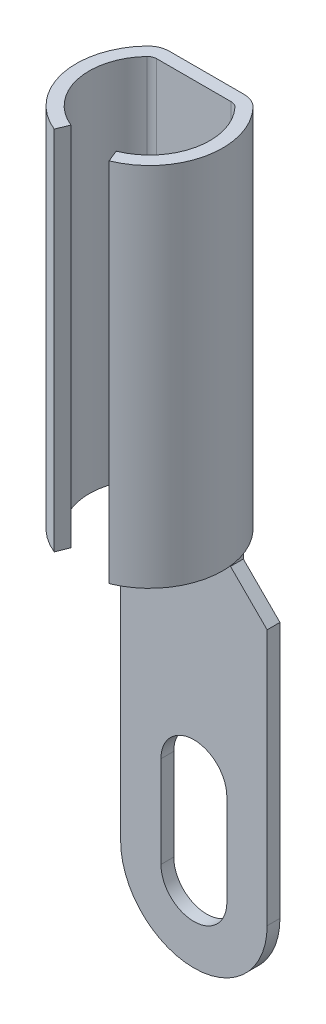
ISO-10303-21;
HEADER;
FILE_DESCRIPTION(('STEP AP214'),'2;1');
FILE_NAME('part.step','',(''),(''),'','','');
FILE_SCHEMA(('AUTOMOTIVE_DESIGN { 1 0 10303 214 1 1 1 1 }'));
ENDSEC;
DATA;
#1=APPLICATION_CONTEXT('core data for automotive mechanical design processes');
#2=APPLICATION_PROTOCOL_DEFINITION('international standard','automotive_design',2000,#1);
#3=PRODUCT_CONTEXT('',#1,'mechanical');
#4=PRODUCT('Part','Part','',(#3));
#5=PRODUCT_RELATED_PRODUCT_CATEGORY('part','',(#4));
#6=PRODUCT_DEFINITION_FORMATION('','',#4);
#7=PRODUCT_DEFINITION_CONTEXT('part definition',#1,'design');
#8=PRODUCT_DEFINITION('design','',#6,#7);
#9=PRODUCT_DEFINITION_SHAPE('','',#8);
#10=(LENGTH_UNIT() NAMED_UNIT(*) SI_UNIT(.MILLI.,.METRE.));
#11=(NAMED_UNIT(*) PLANE_ANGLE_UNIT() SI_UNIT($,.RADIAN.));
#12=(NAMED_UNIT(*) SI_UNIT($,.STERADIAN.) SOLID_ANGLE_UNIT());
#13=UNCERTAINTY_MEASURE_WITH_UNIT(LENGTH_MEASURE(1.E-05),#10,'distance_accuracy_value','');
#14=(GEOMETRIC_REPRESENTATION_CONTEXT(3) GLOBAL_UNCERTAINTY_ASSIGNED_CONTEXT((#13)) GLOBAL_UNIT_ASSIGNED_CONTEXT((#10,
#11,#12)) REPRESENTATION_CONTEXT('',''));
#15=CARTESIAN_POINT('',(0.,0.,0.));
#16=DIRECTION('',(0.,0.,1.));
#17=DIRECTION('',(1.,0.,0.));
#18=AXIS2_PLACEMENT_3D('',#15,#16,#17);
#19=CARTESIAN_POINT('',(0.,0.,0.));
#20=DIRECTION('',(0.,1.,0.));
#21=DIRECTION('',(0.,0.,1.));
#22=AXIS2_PLACEMENT_3D('',#19,#20,#21);
#23=PLANE('',#22);
#24=DIRECTION('',(0.,0.,1.));
#25=VECTOR('',#24,1.);
#26=CARTESIAN_POINT('',(1.,0.,-1.5612494995996));
#27=LINE('',#26,#25);
#28=CARTESIAN_POINT('',(1.,0.,-1.5612494995996));
#29=VERTEX_POINT('',#28);
#30=CARTESIAN_POINT('',(1.,0.,-1.2112494995996));
#31=VERTEX_POINT('',#30);
#32=EDGE_CURVE('E171',#29,#31,#27,.T.);
#33=ORIENTED_EDGE('',*,*,#32,.F.);
#34=DIRECTION('',(-1.,0.,0.));
#35=VECTOR('',#34,1.);
#36=CARTESIAN_POINT('',(-1.01784055702233,0.,-1.5612494995996));
#37=LINE('',#36,#35);
#38=CARTESIAN_POINT('',(1.01784055702233,0.,-1.5612494995996));
#39=VERTEX_POINT('',#38);
#40=EDGE_CURVE('E195',#39,#29,#37,.T.);
#41=ORIENTED_EDGE('',*,*,#40,.F.);
#42=CARTESIAN_POINT('',(1.01784055702233,0.,-0.9612494995996));
#43=DIRECTION('',(0.,1.,0.));
#44=DIRECTION('',(0.,0.,1.));
#45=AXIS2_PLACEMENT_3D('',#42,#43,#44);
#46=CIRCLE('',#45,0.6);
#47=CARTESIAN_POINT('',(1.45405793860332,0.,-1.37321357085657));
#48=VERTEX_POINT('',#47);
#49=EDGE_CURVE('E153',#48,#39,#46,.T.);
#50=ORIENTED_EDGE('',*,*,#49,.F.);
#51=CARTESIAN_POINT('',(0.,0.,0.));
#52=DIRECTION('',(0.,1.,0.));
#53=DIRECTION('',(0.,0.,1.));
#54=AXIS2_PLACEMENT_3D('',#51,#52,#53);
#55=CIRCLE('',#54,2.);
#56=CARTESIAN_POINT('',(0.75,0.,1.85404962177392));
#57=VERTEX_POINT('',#56);
#58=EDGE_CURVE('E274',#57,#48,#55,.T.);
#59=ORIENTED_EDGE('',*,*,#58,.F.);
#60=DIRECTION('',(-0.375000000000002,0.,-0.927024810886957));
#61=VECTOR('',#60,1.);
#62=CARTESIAN_POINT('',(0.75,0.,1.85404962177392));
#63=LINE('',#62,#61);
#64=CARTESIAN_POINT('',(0.618749999999999,0.,1.52959093796348));
#65=VERTEX_POINT('',#64);
#66=EDGE_CURVE('E271',#57,#65,#63,.T.);
#67=ORIENTED_EDGE('',*,*,#66,.T.);
#68=CARTESIAN_POINT('',(0.,0.,0.));
#69=DIRECTION('',(0.,1.,0.));
#70=DIRECTION('',(1.,0.,0.));
#71=AXIS2_PLACEMENT_3D('',#68,#69,#70);
#72=CIRCLE('',#71,1.65);
#73=CARTESIAN_POINT('',(1.19959779934774,0.,-1.13290119595667));
#74=VERTEX_POINT('',#73);
#75=EDGE_CURVE('E267',#65,#74,#72,.T.);
#76=ORIENTED_EDGE('',*,*,#75,.T.);
#77=CARTESIAN_POINT('',(1.01784055702233,0.,-0.9612494995996));
#78=DIRECTION('',(0.,1.,0.));
#79=DIRECTION('',(1.,0.,0.));
#80=AXIS2_PLACEMENT_3D('',#77,#78,#79);
#81=CIRCLE('',#80,0.25);
#82=CARTESIAN_POINT('',(1.01784055702233,0.,-1.2112494995996));
#83=VERTEX_POINT('',#82);
#84=EDGE_CURVE('E183',#74,#83,#81,.T.);
#85=ORIENTED_EDGE('',*,*,#84,.T.);
#86=DIRECTION('',(1.,0.,0.));
#87=VECTOR('',#86,1.);
#88=CARTESIAN_POINT('',(-1.01784055702233,0.,-1.2112494995996));
#89=LINE('',#88,#87);
#90=EDGE_CURVE('E189',#83,#31,#89,.F.);
#91=ORIENTED_EDGE('',*,*,#90,.T.);
#92=EDGE_LOOP('',(#33,#41,#50,#59,#67,#76,#85,#91));
#93=FACE_BOUND('',#92,.T.);
#94=ADVANCED_FACE('F31',(#93),#23,.F.);
#95=CARTESIAN_POINT('',(0.,10.,0.));
#96=DIRECTION('',(0.,-1.,0.));
#97=DIRECTION('',(0.,0.,-1.));
#98=AXIS2_PLACEMENT_3D('',#95,#96,#97);
#99=CYLINDRICAL_SURFACE('',#98,2.);
#100=CARTESIAN_POINT('',(0.,0.,0.));
#101=DIRECTION('',(0.,1.,0.));
#102=DIRECTION('',(0.,0.,1.));
#103=AXIS2_PLACEMENT_3D('',#100,#101,#102);
#104=CIRCLE('',#103,2.);
#105=CARTESIAN_POINT('',(-1.45405793860332,0.,-1.37321357085657));
#106=VERTEX_POINT('',#105);
#107=CARTESIAN_POINT('',(-0.75,0.,1.85404962177392));
#108=VERTEX_POINT('',#107);
#109=EDGE_CURVE('E167',#106,#108,#104,.T.);
#110=ORIENTED_EDGE('',*,*,#109,.T.);
#111=DIRECTION('',(0.,-1.,0.));
#112=VECTOR('',#111,1.);
#113=CARTESIAN_POINT('',(-0.75,10.,1.85404962177392));
#114=LINE('',#113,#112);
#115=CARTESIAN_POINT('',(-0.75,10.,1.85404962177392));
#116=VERTEX_POINT('',#115);
#117=EDGE_CURVE('E11',#116,#108,#114,.T.);
#118=ORIENTED_EDGE('',*,*,#117,.F.);
#119=CARTESIAN_POINT('',(0.,10.,0.));
#120=DIRECTION('',(0.,1.,0.));
#121=DIRECTION('',(0.,0.,1.));
#122=AXIS2_PLACEMENT_3D('',#119,#120,#121);
#123=CIRCLE('',#122,2.);
#124=CARTESIAN_POINT('',(-1.45405793860332,10.,-1.37321357085657));
#125=VERTEX_POINT('',#124);
#126=EDGE_CURVE('E107',#125,#116,#123,.T.);
#127=ORIENTED_EDGE('',*,*,#126,.F.);
#128=DIRECTION('',(0.,-1.,0.));
#129=VECTOR('',#128,1.);
#130=CARTESIAN_POINT('',(-1.45405793860332,10.,-1.37321357085657));
#131=LINE('',#130,#129);
#132=EDGE_CURVE('E163',#125,#106,#131,.T.);
#133=ORIENTED_EDGE('',*,*,#132,.T.);
#134=EDGE_LOOP('',(#110,#118,#127,#133));
#135=FACE_BOUND('',#134,.T.);
#136=ADVANCED_FACE('F33',(#135),#99,.T.);
#137=CARTESIAN_POINT('',(-0.61875,10.,1.52959093796348));
#138=DIRECTION('',(0.927024810886958,0.,0.375));
#139=DIRECTION('',(0.375000000000001,0.,-0.927024810886958));
#140=AXIS2_PLACEMENT_3D('',#137,#138,#139);
#141=PLANE('',#140);
#142=DIRECTION('',(-0.375,0.,0.927024810886958));
#143=VECTOR('',#142,1.);
#144=CARTESIAN_POINT('',(-0.61875,0.,1.52959093796348));
#145=LINE('',#144,#143);
#146=CARTESIAN_POINT('',(-0.61875,0.,1.52959093796348));
#147=VERTEX_POINT('',#146);
#148=EDGE_CURVE('E170',#147,#108,#145,.T.);
#149=ORIENTED_EDGE('',*,*,#148,.F.);
#150=DIRECTION('',(0.,-1.,0.));
#151=VECTOR('',#150,1.);
#152=CARTESIAN_POINT('',(-0.61875,10.,1.52959093796348));
#153=LINE('',#152,#151);
#154=CARTESIAN_POINT('',(-0.61875,10.,1.52959093796348));
#155=VERTEX_POINT('',#154);
#156=EDGE_CURVE('E40',#155,#147,#153,.T.);
#157=ORIENTED_EDGE('',*,*,#156,.F.);
#158=DIRECTION('',(-0.375,0.,0.927024810886958));
#159=VECTOR('',#158,1.);
#160=CARTESIAN_POINT('',(-0.61875,10.,1.52959093796348));
#161=LINE('',#160,#159);
#162=EDGE_CURVE('E241',#155,#116,#161,.T.);
#163=ORIENTED_EDGE('',*,*,#162,.T.);
#164=ORIENTED_EDGE('',*,*,#117,.T.);
#165=EDGE_LOOP('',(#149,#157,#163,#164));
#166=FACE_BOUND('',#165,.T.);
#167=ADVANCED_FACE('F227',(#166),#141,.T.);
#168=CARTESIAN_POINT('',(0.,10.,0.));
#169=DIRECTION('',(0.,-1.,0.));
#170=DIRECTION('',(0.,0.,-1.));
#171=AXIS2_PLACEMENT_3D('',#168,#169,#170);
#172=CYLINDRICAL_SURFACE('',#171,1.65);
#173=CARTESIAN_POINT('',(0.,0.,0.));
#174=DIRECTION('',(0.,1.,0.));
#175=DIRECTION('',(1.,0.,0.));
#176=AXIS2_PLACEMENT_3D('',#173,#174,#175);
#177=CIRCLE('',#176,1.65);
#178=CARTESIAN_POINT('',(-1.19959779934774,0.,-1.13290119595667));
#179=VERTEX_POINT('',#178);
#180=EDGE_CURVE('E174',#179,#147,#177,.T.);
#181=ORIENTED_EDGE('',*,*,#180,.F.);
#182=DIRECTION('',(0.,-1.,0.));
#183=VECTOR('',#182,1.);
#184=CARTESIAN_POINT('',(-1.19959779934774,10.,-1.13290119595667));
#185=LINE('',#184,#183);
#186=CARTESIAN_POINT('',(-1.19959779934774,10.,-1.13290119595667));
#187=VERTEX_POINT('',#186);
#188=EDGE_CURVE('E216',#187,#179,#185,.T.);
#189=ORIENTED_EDGE('',*,*,#188,.F.);
#190=CARTESIAN_POINT('',(0.,10.,0.));
#191=DIRECTION('',(0.,1.,0.));
#192=DIRECTION('',(1.,0.,0.));
#193=AXIS2_PLACEMENT_3D('',#190,#191,#192);
#194=CIRCLE('',#193,1.65);
#195=EDGE_CURVE('E224',#187,#155,#194,.T.);
#196=ORIENTED_EDGE('',*,*,#195,.T.);
#197=ORIENTED_EDGE('',*,*,#156,.T.);
#198=EDGE_LOOP('',(#181,#189,#196,#197));
#199=FACE_BOUND('',#198,.T.);
#200=ADVANCED_FACE('F222',(#199),#172,.F.);
#201=CARTESIAN_POINT('',(-1.01784055702233,10.,-0.9612494995996));
#202=DIRECTION('',(0.,-1.,0.));
#203=DIRECTION('',(0.,0.,-1.));
#204=AXIS2_PLACEMENT_3D('',#201,#202,#203);
#205=CYLINDRICAL_SURFACE('',#204,0.25);
#206=CARTESIAN_POINT('',(-1.01784055702233,0.,-0.9612494995996));
#207=DIRECTION('',(0.,1.,0.));
#208=DIRECTION('',(1.,0.,0.));
#209=AXIS2_PLACEMENT_3D('',#206,#207,#208);
#210=CIRCLE('',#209,0.25);
#211=CARTESIAN_POINT('',(-1.01784055702233,0.,-1.2112494995996));
#212=VERTEX_POINT('',#211);
#213=EDGE_CURVE('E177',#212,#179,#210,.T.);
#214=ORIENTED_EDGE('',*,*,#213,.F.);
#215=DIRECTION('',(0.,-1.,0.));
#216=VECTOR('',#215,1.);
#217=CARTESIAN_POINT('',(-1.01784055702233,10.,-1.2112494995996));
#218=LINE('',#217,#216);
#219=CARTESIAN_POINT('',(-1.01784055702233,10.,-1.2112494995996));
#220=VERTEX_POINT('',#219);
#221=EDGE_CURVE('E213',#220,#212,#218,.T.);
#222=ORIENTED_EDGE('',*,*,#221,.F.);
#223=CARTESIAN_POINT('',(-1.01784055702233,10.,-0.9612494995996));
#224=DIRECTION('',(0.,1.,0.));
#225=DIRECTION('',(1.,0.,0.));
#226=AXIS2_PLACEMENT_3D('',#223,#224,#225);
#227=CIRCLE('',#226,0.25);
#228=EDGE_CURVE('E238',#220,#187,#227,.T.);
#229=ORIENTED_EDGE('',*,*,#228,.T.);
#230=ORIENTED_EDGE('',*,*,#188,.T.);
#231=EDGE_LOOP('',(#214,#222,#229,#230));
#232=FACE_BOUND('',#231,.T.);
#233=ADVANCED_FACE('F235',(#232),#205,.F.);
#234=CARTESIAN_POINT('',(-1.01784055702233,10.,-1.2112494995996));
#235=DIRECTION('',(0.,0.,1.));
#236=DIRECTION('',(1.,0.,0.));
#237=AXIS2_PLACEMENT_3D('',#234,#235,#236);
#238=PLANE('',#237);
#239=ORIENTED_EDGE('',*,*,#90,.F.);
#240=DIRECTION('',(0.,-1.,0.));
#241=VECTOR('',#240,1.);
#242=CARTESIAN_POINT('',(1.01784055702233,10.,-1.2112494995996));
#243=LINE('',#242,#241);
#244=CARTESIAN_POINT('',(1.01784055702233,10.,-1.2112494995996));
#245=VERTEX_POINT('',#244);
#246=EDGE_CURVE('E211',#245,#83,#243,.T.);
#247=ORIENTED_EDGE('',*,*,#246,.F.);
#248=DIRECTION('',(1.,0.,0.));
#249=VECTOR('',#248,1.);
#250=CARTESIAN_POINT('',(-1.01784055702233,10.,-1.2112494995996));
#251=LINE('',#250,#249);
#252=EDGE_CURVE('E243',#245,#220,#251,.F.);
#253=ORIENTED_EDGE('',*,*,#252,.T.);
#254=ORIENTED_EDGE('',*,*,#221,.T.);
#255=CARTESIAN_POINT('',(-1.,0.,-1.2112494995996));
#256=VERTEX_POINT('',#255);
#257=EDGE_CURVE('E180',#256,#212,#89,.F.);
#258=ORIENTED_EDGE('',*,*,#257,.F.);
#259=DIRECTION('',(0.,-1.,0.));
#260=VECTOR('',#259,1.);
#261=CARTESIAN_POINT('',(-1.,0.,-1.2112494995996));
#262=LINE('',#261,#260);
#263=CARTESIAN_POINT('',(-1.,-0.999999999999999,-1.2112494995996));
#264=VERTEX_POINT('',#263);
#265=EDGE_CURVE('E48',#256,#264,#262,.T.);
#266=ORIENTED_EDGE('',*,*,#265,.T.);
#267=DIRECTION('',(-0.707106781186547,-0.707106781186548,0.));
#268=VECTOR('',#267,1.);
#269=CARTESIAN_POINT('',(-1.,-0.999999999999999,-1.2112494995996));
#270=LINE('',#269,#268);
#271=CARTESIAN_POINT('',(-2.,-2.,-1.2112494995996));
#272=VERTEX_POINT('',#271);
#273=EDGE_CURVE('E363',#264,#272,#270,.T.);
#274=ORIENTED_EDGE('',*,*,#273,.T.);
#275=DIRECTION('',(0.,-1.,0.));
#276=VECTOR('',#275,1.);
#277=CARTESIAN_POINT('',(-2.,-2.,-1.2112494995996));
#278=LINE('',#277,#276);
#279=CARTESIAN_POINT('',(-2.,-9.,-1.2112494995996));
#280=VERTEX_POINT('',#279);
#281=EDGE_CURVE('E366',#272,#280,#278,.T.);
#282=ORIENTED_EDGE('',*,*,#281,.T.);
#283=CARTESIAN_POINT('',(0.,-9.,-1.2112494995996));
#284=DIRECTION('',(0.,0.,1.));
#285=DIRECTION('',(1.,0.,0.));
#286=AXIS2_PLACEMENT_3D('',#283,#284,#285);
#287=CIRCLE('',#286,2.);
#288=CARTESIAN_POINT('',(2.,-9.,-1.2112494995996));
#289=VERTEX_POINT('',#288);
#290=EDGE_CURVE('E369',#280,#289,#287,.T.);
#291=ORIENTED_EDGE('',*,*,#290,.T.);
#292=DIRECTION('',(0.,1.,0.));
#293=VECTOR('',#292,1.);
#294=CARTESIAN_POINT('',(2.,-2.,-1.2112494995996));
#295=LINE('',#294,#293);
#296=CARTESIAN_POINT('',(2.,-2.,-1.2112494995996));
#297=VERTEX_POINT('',#296);
#298=EDGE_CURVE('E372',#289,#297,#295,.T.);
#299=ORIENTED_EDGE('',*,*,#298,.T.);
#300=DIRECTION('',(-0.707106781186548,0.707106781186547,0.));
#301=VECTOR('',#300,1.);
#302=CARTESIAN_POINT('',(1.,-1.,-1.2112494995996));
#303=LINE('',#302,#301);
#304=CARTESIAN_POINT('',(1.,-1.,-1.2112494995996));
#305=VERTEX_POINT('',#304);
#306=EDGE_CURVE('E343',#297,#305,#303,.T.);
#307=ORIENTED_EDGE('',*,*,#306,.T.);
#308=DIRECTION('',(0.,1.,0.));
#309=VECTOR('',#308,1.);
#310=CARTESIAN_POINT('',(1.,0.,-1.2112494995996));
#311=LINE('',#310,#309);
#312=EDGE_CURVE('E375',#305,#31,#311,.T.);
#313=ORIENTED_EDGE('',*,*,#312,.T.);
#314=EDGE_LOOP('',(#239,#247,#253,#254,#258,#266,#274,#282,#291,#299,#307,#313));
#315=FACE_BOUND('',#314,.T.);
#316=CARTESIAN_POINT('',(0.,-9.,-1.2112494995996));
#317=DIRECTION('',(0.,0.,1.));
#318=DIRECTION('',(1.,0.,0.));
#319=AXIS2_PLACEMENT_3D('',#316,#317,#318);
#320=CIRCLE('',#319,0.9);
#321=CARTESIAN_POINT('',(-0.9,-9.,-1.2112494995996));
#322=VERTEX_POINT('',#321);
#323=CARTESIAN_POINT('',(0.9,-9.,-1.2112494995996));
#324=VERTEX_POINT('',#323);
#325=EDGE_CURVE('E622',#322,#324,#320,.T.);
#326=ORIENTED_EDGE('',*,*,#325,.F.);
#327=DIRECTION('',(0.,-1.,0.));
#328=VECTOR('',#327,1.);
#329=CARTESIAN_POINT('',(-0.9,-6.5,-1.2112494995996));
#330=LINE('',#329,#328);
#331=CARTESIAN_POINT('',(-0.9,-6.5,-1.2112494995996));
#332=VERTEX_POINT('',#331);
#333=EDGE_CURVE('E627',#332,#322,#330,.T.);
#334=ORIENTED_EDGE('',*,*,#333,.F.);
#335=CARTESIAN_POINT('',(0.,-6.5,-1.2112494995996));
#336=DIRECTION('',(0.,0.,1.));
#337=DIRECTION('',(1.,0.,0.));
#338=AXIS2_PLACEMENT_3D('',#335,#336,#337);
#339=CIRCLE('',#338,0.9);
#340=CARTESIAN_POINT('',(0.9,-6.5,-1.2112494995996));
#341=VERTEX_POINT('',#340);
#342=EDGE_CURVE('E621',#341,#332,#339,.T.);
#343=ORIENTED_EDGE('',*,*,#342,.F.);
#344=DIRECTION('',(0.,1.,0.));
#345=VECTOR('',#344,1.);
#346=CARTESIAN_POINT('',(0.9,-9.,-1.2112494995996));
#347=LINE('',#346,#345);
#348=EDGE_CURVE('E610',#324,#341,#347,.T.);
#349=ORIENTED_EDGE('',*,*,#348,.F.);
#350=EDGE_LOOP('',(#326,#334,#343,#349));
#351=FACE_BOUND('',#350,.T.);
#352=ADVANCED_FACE('F406',(#315,#351),#238,.T.);
#353=CARTESIAN_POINT('',(1.01784055702233,10.,-0.9612494995996));
#354=DIRECTION('',(0.,-1.,0.));
#355=DIRECTION('',(0.,0.,-1.));
#356=AXIS2_PLACEMENT_3D('',#353,#354,#355);
#357=CYLINDRICAL_SURFACE('',#356,0.25);
#358=ORIENTED_EDGE('',*,*,#84,.F.);
#359=DIRECTION('',(0.,-1.,0.));
#360=VECTOR('',#359,1.);
#361=CARTESIAN_POINT('',(1.19959779934774,10.,-1.13290119595667));
#362=LINE('',#361,#360);
#363=CARTESIAN_POINT('',(1.19959779934774,10.,-1.13290119595667));
#364=VERTEX_POINT('',#363);
#365=EDGE_CURVE('E209',#364,#74,#362,.T.);
#366=ORIENTED_EDGE('',*,*,#365,.F.);
#367=CARTESIAN_POINT('',(1.01784055702233,10.,-0.9612494995996));
#368=DIRECTION('',(0.,1.,0.));
#369=DIRECTION('',(1.,0.,0.));
#370=AXIS2_PLACEMENT_3D('',#367,#368,#369);
#371=CIRCLE('',#370,0.25);
#372=EDGE_CURVE('E249',#364,#245,#371,.T.);
#373=ORIENTED_EDGE('',*,*,#372,.T.);
#374=ORIENTED_EDGE('',*,*,#246,.T.);
#375=EDGE_LOOP('',(#358,#366,#373,#374));
#376=FACE_BOUND('',#375,.T.);
#377=ADVANCED_FACE('F461',(#376),#357,.F.);
#378=CARTESIAN_POINT('',(0.,10.,0.));
#379=DIRECTION('',(0.,-1.,0.));
#380=DIRECTION('',(0.,0.,-1.));
#381=AXIS2_PLACEMENT_3D('',#378,#379,#380);
#382=CYLINDRICAL_SURFACE('',#381,1.65);
#383=ORIENTED_EDGE('',*,*,#75,.F.);
#384=DIRECTION('',(0.,-1.,0.));
#385=VECTOR('',#384,1.);
#386=CARTESIAN_POINT('',(0.618749999999999,10.,1.52959093796348));
#387=LINE('',#386,#385);
#388=CARTESIAN_POINT('',(0.618749999999999,10.,1.52959093796348));
#389=VERTEX_POINT('',#388);
#390=EDGE_CURVE('E207',#389,#65,#387,.T.);
#391=ORIENTED_EDGE('',*,*,#390,.F.);
#392=CARTESIAN_POINT('',(0.,10.,0.));
#393=DIRECTION('',(0.,1.,0.));
#394=DIRECTION('',(1.,0.,0.));
#395=AXIS2_PLACEMENT_3D('',#392,#393,#394);
#396=CIRCLE('',#395,1.65);
#397=EDGE_CURVE('E252',#389,#364,#396,.T.);
#398=ORIENTED_EDGE('',*,*,#397,.T.);
#399=ORIENTED_EDGE('',*,*,#365,.T.);
#400=EDGE_LOOP('',(#383,#391,#398,#399));
#401=FACE_BOUND('',#400,.T.);
#402=ADVANCED_FACE('F264',(#401),#382,.F.);
#403=CARTESIAN_POINT('',(0.75,10.,1.85404962177392));
#404=DIRECTION('',(-0.927024810886957,0.,0.375000000000002));
#405=DIRECTION('',(0.375000000000002,0.,0.927024810886957));
#406=AXIS2_PLACEMENT_3D('',#403,#404,#405);
#407=PLANE('',#406);
#408=ORIENTED_EDGE('',*,*,#66,.F.);
#409=DIRECTION('',(0.,-1.,0.));
#410=VECTOR('',#409,1.);
#411=CARTESIAN_POINT('',(0.75,10.,1.85404962177392));
#412=LINE('',#411,#410);
#413=CARTESIAN_POINT('',(0.75,10.,1.85404962177392));
#414=VERTEX_POINT('',#413);
#415=EDGE_CURVE('E205',#414,#57,#412,.T.);
#416=ORIENTED_EDGE('',*,*,#415,.F.);
#417=DIRECTION('',(-0.375000000000002,0.,-0.927024810886957));
#418=VECTOR('',#417,1.);
#419=CARTESIAN_POINT('',(0.75,10.,1.85404962177392));
#420=LINE('',#419,#418);
#421=EDGE_CURVE('E255',#414,#389,#420,.T.);
#422=ORIENTED_EDGE('',*,*,#421,.T.);
#423=ORIENTED_EDGE('',*,*,#390,.T.);
#424=EDGE_LOOP('',(#408,#416,#422,#423));
#425=FACE_BOUND('',#424,.T.);
#426=ADVANCED_FACE('F259',(#425),#407,.T.);
#427=CARTESIAN_POINT('',(0.,10.,0.));
#428=DIRECTION('',(0.,-1.,0.));
#429=DIRECTION('',(0.,0.,-1.));
#430=AXIS2_PLACEMENT_3D('',#427,#428,#429);
#431=CYLINDRICAL_SURFACE('',#430,2.);
#432=ORIENTED_EDGE('',*,*,#58,.T.);
#433=DIRECTION('',(0.,-1.,0.));
#434=VECTOR('',#433,1.);
#435=CARTESIAN_POINT('',(1.45405793860332,10.,-1.37321357085657));
#436=LINE('',#435,#434);
#437=CARTESIAN_POINT('',(1.45405793860332,10.,-1.37321357085657));
#438=VERTEX_POINT('',#437);
#439=EDGE_CURVE('E157',#438,#48,#436,.T.);
#440=ORIENTED_EDGE('',*,*,#439,.F.);
#441=CARTESIAN_POINT('',(0.,10.,0.));
#442=DIRECTION('',(0.,1.,0.));
#443=DIRECTION('',(0.,0.,1.));
#444=AXIS2_PLACEMENT_3D('',#441,#442,#443);
#445=CIRCLE('',#444,2.);
#446=EDGE_CURVE('E144',#414,#438,#445,.T.);
#447=ORIENTED_EDGE('',*,*,#446,.F.);
#448=ORIENTED_EDGE('',*,*,#415,.T.);
#449=EDGE_LOOP('',(#432,#440,#447,#448));
#450=FACE_BOUND('',#449,.T.);
#451=ADVANCED_FACE('F277',(#450),#431,.T.);
#452=CARTESIAN_POINT('',(1.01784055702233,10.,-0.9612494995996));
#453=DIRECTION('',(0.,-1.,0.));
#454=DIRECTION('',(0.,0.,-1.));
#455=AXIS2_PLACEMENT_3D('',#452,#453,#454);
#456=CYLINDRICAL_SURFACE('',#455,0.6);
#457=ORIENTED_EDGE('',*,*,#49,.T.);
#458=DIRECTION('',(0.,-1.,0.));
#459=VECTOR('',#458,1.);
#460=CARTESIAN_POINT('',(1.01784055702233,10.,-1.5612494995996));
#461=LINE('',#460,#459);
#462=CARTESIAN_POINT('',(1.01784055702233,10.,-1.5612494995996));
#463=VERTEX_POINT('',#462);
#464=EDGE_CURVE('E150',#463,#39,#461,.T.);
#465=ORIENTED_EDGE('',*,*,#464,.F.);
#466=CARTESIAN_POINT('',(1.01784055702233,10.,-0.9612494995996));
#467=DIRECTION('',(0.,1.,0.));
#468=DIRECTION('',(0.,0.,1.));
#469=AXIS2_PLACEMENT_3D('',#466,#467,#468);
#470=CIRCLE('',#469,0.6);
#471=EDGE_CURVE('E136',#438,#463,#470,.T.);
#472=ORIENTED_EDGE('',*,*,#471,.F.);
#473=ORIENTED_EDGE('',*,*,#439,.T.);
#474=EDGE_LOOP('',(#457,#465,#472,#473));
#475=FACE_BOUND('',#474,.T.);
#476=ADVANCED_FACE('F151',(#475),#456,.T.);
#477=CARTESIAN_POINT('',(-1.01784055702233,10.,-1.5612494995996));
#478=DIRECTION('',(0.,0.,1.));
#479=DIRECTION('',(1.,0.,0.));
#480=AXIS2_PLACEMENT_3D('',#477,#478,#479);
#481=PLANE('',#480);
#482=ORIENTED_EDGE('',*,*,#40,.T.);
#483=DIRECTION('',(0.,1.,0.));
#484=VECTOR('',#483,1.);
#485=CARTESIAN_POINT('',(1.,0.,-1.5612494995996));
#486=LINE('',#485,#484);
#487=CARTESIAN_POINT('',(1.,-1.,-1.5612494995996));
#488=VERTEX_POINT('',#487);
#489=EDGE_CURVE('E284',#488,#29,#486,.T.);
#490=ORIENTED_EDGE('',*,*,#489,.F.);
#491=DIRECTION('',(-0.707106781186548,0.707106781186547,0.));
#492=VECTOR('',#491,1.);
#493=CARTESIAN_POINT('',(1.,-1.,-1.5612494995996));
#494=LINE('',#493,#492);
#495=CARTESIAN_POINT('',(2.,-2.,-1.5612494995996));
#496=VERTEX_POINT('',#495);
#497=EDGE_CURVE('E341',#496,#488,#494,.T.);
#498=ORIENTED_EDGE('',*,*,#497,.F.);
#499=DIRECTION('',(0.,1.,0.));
#500=VECTOR('',#499,1.);
#501=CARTESIAN_POINT('',(2.,-2.,-1.5612494995996));
#502=LINE('',#501,#500);
#503=CARTESIAN_POINT('',(2.,-9.,-1.5612494995996));
#504=VERTEX_POINT('',#503);
#505=EDGE_CURVE('E353',#504,#496,#502,.T.);
#506=ORIENTED_EDGE('',*,*,#505,.F.);
#507=CARTESIAN_POINT('',(0.,-9.,-1.5612494995996));
#508=DIRECTION('',(0.,0.,1.));
#509=DIRECTION('',(1.,0.,0.));
#510=AXIS2_PLACEMENT_3D('',#507,#508,#509);
#511=CIRCLE('',#510,2.);
#512=CARTESIAN_POINT('',(-2.,-9.,-1.5612494995996));
#513=VERTEX_POINT('',#512);
#514=EDGE_CURVE('E357',#513,#504,#511,.T.);
#515=ORIENTED_EDGE('',*,*,#514,.F.);
#516=DIRECTION('',(0.,-1.,0.));
#517=VECTOR('',#516,1.);
#518=CARTESIAN_POINT('',(-2.,-2.,-1.5612494995996));
#519=LINE('',#518,#517);
#520=CARTESIAN_POINT('',(-2.,-2.,-1.5612494995996));
#521=VERTEX_POINT('',#520);
#522=EDGE_CURVE('E359',#521,#513,#519,.T.);
#523=ORIENTED_EDGE('',*,*,#522,.F.);
#524=DIRECTION('',(-0.707106781186547,-0.707106781186548,0.));
#525=VECTOR('',#524,1.);
#526=CARTESIAN_POINT('',(-1.,-0.999999999999999,-1.5612494995996));
#527=LINE('',#526,#525);
#528=CARTESIAN_POINT('',(-1.,-0.999999999999999,-1.5612494995996));
#529=VERTEX_POINT('',#528);
#530=EDGE_CURVE('E388',#529,#521,#527,.T.);
#531=ORIENTED_EDGE('',*,*,#530,.F.);
#532=DIRECTION('',(0.,-1.,0.));
#533=VECTOR('',#532,1.);
#534=CARTESIAN_POINT('',(-1.,0.,-1.5612494995996));
#535=LINE('',#534,#533);
#536=CARTESIAN_POINT('',(-1.,0.,-1.5612494995996));
#537=VERTEX_POINT('',#536);
#538=EDGE_CURVE('E385',#537,#529,#535,.T.);
#539=ORIENTED_EDGE('',*,*,#538,.F.);
#540=CARTESIAN_POINT('',(-1.01784055702233,0.,-1.5612494995996));
#541=VERTEX_POINT('',#540);
#542=EDGE_CURVE('E192',#537,#541,#37,.T.);
#543=ORIENTED_EDGE('',*,*,#542,.T.);
#544=DIRECTION('',(0.,-1.,0.));
#545=VECTOR('',#544,1.);
#546=CARTESIAN_POINT('',(-1.01784055702233,10.,-1.5612494995996));
#547=LINE('',#546,#545);
#548=CARTESIAN_POINT('',(-1.01784055702233,10.,-1.5612494995996));
#549=VERTEX_POINT('',#548);
#550=EDGE_CURVE('E158',#549,#541,#547,.T.);
#551=ORIENTED_EDGE('',*,*,#550,.F.);
#552=DIRECTION('',(-1.,0.,0.));
#553=VECTOR('',#552,1.);
#554=CARTESIAN_POINT('',(-1.01784055702233,10.,-1.5612494995996));
#555=LINE('',#554,#553);
#556=EDGE_CURVE('E140',#463,#549,#555,.T.);
#557=ORIENTED_EDGE('',*,*,#556,.F.);
#558=ORIENTED_EDGE('',*,*,#464,.T.);
#559=EDGE_LOOP('',(#482,#490,#498,#506,#515,#523,#531,#539,#543,#551,#557,#558));
#560=FACE_BOUND('',#559,.T.);
#561=DIRECTION('',(0.,-1.,0.));
#562=VECTOR('',#561,1.);
#563=CARTESIAN_POINT('',(-0.9,-6.5,-1.5612494995996));
#564=LINE('',#563,#562);
#565=CARTESIAN_POINT('',(-0.9,-6.5,-1.5612494995996));
#566=VERTEX_POINT('',#565);
#567=CARTESIAN_POINT('',(-0.9,-9.,-1.5612494995996));
#568=VERTEX_POINT('',#567);
#569=EDGE_CURVE('E641',#566,#568,#564,.T.);
#570=ORIENTED_EDGE('',*,*,#569,.T.);
#571=CARTESIAN_POINT('',(0.,-9.,-1.5612494995996));
#572=DIRECTION('',(0.,0.,1.));
#573=DIRECTION('',(1.,0.,0.));
#574=AXIS2_PLACEMENT_3D('',#571,#572,#573);
#575=CIRCLE('',#574,0.9);
#576=CARTESIAN_POINT('',(0.9,-9.,-1.5612494995996));
#577=VERTEX_POINT('',#576);
#578=EDGE_CURVE('E630',#568,#577,#575,.T.);
#579=ORIENTED_EDGE('',*,*,#578,.T.);
#580=DIRECTION('',(0.,1.,0.));
#581=VECTOR('',#580,1.);
#582=CARTESIAN_POINT('',(0.9,-9.,-1.5612494995996));
#583=LINE('',#582,#581);
#584=CARTESIAN_POINT('',(0.9,-6.5,-1.5612494995996));
#585=VERTEX_POINT('',#584);
#586=EDGE_CURVE('E648',#577,#585,#583,.T.);
#587=ORIENTED_EDGE('',*,*,#586,.T.);
#588=CARTESIAN_POINT('',(0.,-6.5,-1.5612494995996));
#589=DIRECTION('',(0.,0.,1.));
#590=DIRECTION('',(1.,0.,0.));
#591=AXIS2_PLACEMENT_3D('',#588,#589,#590);
#592=CIRCLE('',#591,0.9);
#593=EDGE_CURVE('E643',#585,#566,#592,.T.);
#594=ORIENTED_EDGE('',*,*,#593,.T.);
#595=EDGE_LOOP('',(#570,#579,#587,#594));
#596=FACE_BOUND('',#595,.T.);
#597=ADVANCED_FACE('F160',(#560,#596),#481,.F.);
#598=CARTESIAN_POINT('',(-1.01784055702233,10.,-0.9612494995996));
#599=DIRECTION('',(0.,-1.,0.));
#600=DIRECTION('',(0.,0.,-1.));
#601=AXIS2_PLACEMENT_3D('',#598,#599,#600);
#602=CYLINDRICAL_SURFACE('',#601,0.6);
#603=CARTESIAN_POINT('',(-1.01784055702233,0.,-0.9612494995996));
#604=DIRECTION('',(0.,1.,0.));
#605=DIRECTION('',(0.,0.,-1.));
#606=AXIS2_PLACEMENT_3D('',#603,#604,#605);
#607=CIRCLE('',#606,0.6);
#608=EDGE_CURVE('E101',#541,#106,#607,.T.);
#609=ORIENTED_EDGE('',*,*,#608,.T.);
#610=ORIENTED_EDGE('',*,*,#132,.F.);
#611=CARTESIAN_POINT('',(-1.01784055702233,10.,-0.9612494995996));
#612=DIRECTION('',(0.,1.,0.));
#613=DIRECTION('',(0.,0.,-1.));
#614=AXIS2_PLACEMENT_3D('',#611,#612,#613);
#615=CIRCLE('',#614,0.6);
#616=EDGE_CURVE('E57',#549,#125,#615,.T.);
#617=ORIENTED_EDGE('',*,*,#616,.F.);
#618=ORIENTED_EDGE('',*,*,#550,.T.);
#619=EDGE_LOOP('',(#609,#610,#617,#618));
#620=FACE_BOUND('',#619,.T.);
#621=ADVANCED_FACE('F444',(#620),#602,.T.);
#622=CARTESIAN_POINT('',(0.,10.,0.));
#623=DIRECTION('',(0.,1.,0.));
#624=DIRECTION('',(0.,0.,1.));
#625=AXIS2_PLACEMENT_3D('',#622,#623,#624);
#626=PLANE('',#625);
#627=ORIENTED_EDGE('',*,*,#126,.T.);
#628=ORIENTED_EDGE('',*,*,#162,.F.);
#629=ORIENTED_EDGE('',*,*,#195,.F.);
#630=ORIENTED_EDGE('',*,*,#228,.F.);
#631=ORIENTED_EDGE('',*,*,#252,.F.);
#632=ORIENTED_EDGE('',*,*,#372,.F.);
#633=ORIENTED_EDGE('',*,*,#397,.F.);
#634=ORIENTED_EDGE('',*,*,#421,.F.);
#635=ORIENTED_EDGE('',*,*,#446,.T.);
#636=ORIENTED_EDGE('',*,*,#471,.T.);
#637=ORIENTED_EDGE('',*,*,#556,.T.);
#638=ORIENTED_EDGE('',*,*,#616,.T.);
#639=EDGE_LOOP('',(#627,#628,#629,#630,#631,#632,#633,#634,#635,#636,#637,#638));
#640=FACE_BOUND('',#639,.T.);
#641=ADVANCED_FACE('F138',(#640),#626,.T.);
#642=ORIENTED_EDGE('',*,*,#542,.F.);
#643=DIRECTION('',(0.,0.,1.));
#644=VECTOR('',#643,1.);
#645=CARTESIAN_POINT('',(-1.,0.,-1.5612494995996));
#646=LINE('',#645,#644);
#647=EDGE_CURVE('E319',#537,#256,#646,.T.);
#648=ORIENTED_EDGE('',*,*,#647,.T.);
#649=ORIENTED_EDGE('',*,*,#257,.T.);
#650=ORIENTED_EDGE('',*,*,#213,.T.);
#651=ORIENTED_EDGE('',*,*,#180,.T.);
#652=ORIENTED_EDGE('',*,*,#148,.T.);
#653=ORIENTED_EDGE('',*,*,#109,.F.);
#654=ORIENTED_EDGE('',*,*,#608,.F.);
#655=EDGE_LOOP('',(#642,#648,#649,#650,#651,#652,#653,#654));
#656=FACE_BOUND('',#655,.T.);
#657=ADVANCED_FACE('F231',(#656),#23,.F.);
#658=CARTESIAN_POINT('',(1.,0.,-1.5612494995996));
#659=DIRECTION('',(1.,0.,0.));
#660=DIRECTION('',(0.,1.,0.));
#661=AXIS2_PLACEMENT_3D('',#658,#659,#660);
#662=PLANE('',#661);
#663=ORIENTED_EDGE('',*,*,#312,.F.);
#664=DIRECTION('',(0.,0.,1.));
#665=VECTOR('',#664,1.);
#666=CARTESIAN_POINT('',(1.,-1.,-1.5612494995996));
#667=LINE('',#666,#665);
#668=EDGE_CURVE('E348',#488,#305,#667,.T.);
#669=ORIENTED_EDGE('',*,*,#668,.F.);
#670=ORIENTED_EDGE('',*,*,#489,.T.);
#671=ORIENTED_EDGE('',*,*,#32,.T.);
#672=EDGE_LOOP('',(#663,#669,#670,#671));
#673=FACE_BOUND('',#672,.T.);
#674=ADVANCED_FACE('F438',(#673),#662,.T.);
#675=CARTESIAN_POINT('',(1.,-1.,-1.5612494995996));
#676=DIRECTION('',(0.707106781186547,0.707106781186548,0.));
#677=DIRECTION('',(-0.707106781186548,0.707106781186547,0.));
#678=AXIS2_PLACEMENT_3D('',#675,#676,#677);
#679=PLANE('',#678);
#680=ORIENTED_EDGE('',*,*,#306,.F.);
#681=DIRECTION('',(0.,0.,1.));
#682=VECTOR('',#681,1.);
#683=CARTESIAN_POINT('',(2.,-2.,-1.5612494995996));
#684=LINE('',#683,#682);
#685=EDGE_CURVE('E339',#496,#297,#684,.T.);
#686=ORIENTED_EDGE('',*,*,#685,.F.);
#687=ORIENTED_EDGE('',*,*,#497,.T.);
#688=ORIENTED_EDGE('',*,*,#668,.T.);
#689=EDGE_LOOP('',(#680,#686,#687,#688));
#690=FACE_BOUND('',#689,.T.);
#691=ADVANCED_FACE('F340',(#690),#679,.T.);
#692=CARTESIAN_POINT('',(2.,-2.,-1.5612494995996));
#693=DIRECTION('',(1.,0.,0.));
#694=DIRECTION('',(0.,1.,0.));
#695=AXIS2_PLACEMENT_3D('',#692,#693,#694);
#696=PLANE('',#695);
#697=ORIENTED_EDGE('',*,*,#298,.F.);
#698=DIRECTION('',(0.,0.,1.));
#699=VECTOR('',#698,1.);
#700=CARTESIAN_POINT('',(2.,-9.,-1.5612494995996));
#701=LINE('',#700,#699);
#702=EDGE_CURVE('E349',#504,#289,#701,.T.);
#703=ORIENTED_EDGE('',*,*,#702,.F.);
#704=ORIENTED_EDGE('',*,*,#505,.T.);
#705=ORIENTED_EDGE('',*,*,#685,.T.);
#706=EDGE_LOOP('',(#697,#703,#704,#705));
#707=FACE_BOUND('',#706,.T.);
#708=ADVANCED_FACE('F356',(#707),#696,.T.);
#709=CARTESIAN_POINT('',(0.,-9.,-1.5612494995996));
#710=DIRECTION('',(0.,0.,1.));
#711=DIRECTION('',(1.,0.,0.));
#712=AXIS2_PLACEMENT_3D('',#709,#710,#711);
#713=CYLINDRICAL_SURFACE('',#712,2.);
#714=ORIENTED_EDGE('',*,*,#290,.F.);
#715=DIRECTION('',(0.,0.,1.));
#716=VECTOR('',#715,1.);
#717=CARTESIAN_POINT('',(-2.,-9.,-1.5612494995996));
#718=LINE('',#717,#716);
#719=EDGE_CURVE('E401',#513,#280,#718,.T.);
#720=ORIENTED_EDGE('',*,*,#719,.F.);
#721=ORIENTED_EDGE('',*,*,#514,.T.);
#722=ORIENTED_EDGE('',*,*,#702,.T.);
#723=EDGE_LOOP('',(#714,#720,#721,#722));
#724=FACE_BOUND('',#723,.T.);
#725=ADVANCED_FACE('F405',(#724),#713,.T.);
#726=CARTESIAN_POINT('',(-2.,-2.,-1.5612494995996));
#727=DIRECTION('',(-1.,0.,0.));
#728=DIRECTION('',(0.,0.,1.));
#729=AXIS2_PLACEMENT_3D('',#726,#727,#728);
#730=PLANE('',#729);
#731=ORIENTED_EDGE('',*,*,#281,.F.);
#732=DIRECTION('',(0.,0.,1.));
#733=VECTOR('',#732,1.);
#734=CARTESIAN_POINT('',(-2.,-2.,-1.5612494995996));
#735=LINE('',#734,#733);
#736=EDGE_CURVE('E399',#521,#272,#735,.T.);
#737=ORIENTED_EDGE('',*,*,#736,.F.);
#738=ORIENTED_EDGE('',*,*,#522,.T.);
#739=ORIENTED_EDGE('',*,*,#719,.T.);
#740=EDGE_LOOP('',(#731,#737,#738,#739));
#741=FACE_BOUND('',#740,.T.);
#742=ADVANCED_FACE('F411',(#741),#730,.T.);
#743=CARTESIAN_POINT('',(-1.,-0.999999999999999,-1.5612494995996));
#744=DIRECTION('',(-0.707106781186548,0.707106781186547,0.));
#745=DIRECTION('',(-0.707106781186547,-0.707106781186548,0.));
#746=AXIS2_PLACEMENT_3D('',#743,#744,#745);
#747=PLANE('',#746);
#748=ORIENTED_EDGE('',*,*,#273,.F.);
#749=DIRECTION('',(0.,0.,1.));
#750=VECTOR('',#749,1.);
#751=CARTESIAN_POINT('',(-1.,-0.999999999999999,-1.5612494995996));
#752=LINE('',#751,#750);
#753=EDGE_CURVE('E394',#529,#264,#752,.T.);
#754=ORIENTED_EDGE('',*,*,#753,.F.);
#755=ORIENTED_EDGE('',*,*,#530,.T.);
#756=ORIENTED_EDGE('',*,*,#736,.T.);
#757=EDGE_LOOP('',(#748,#754,#755,#756));
#758=FACE_BOUND('',#757,.T.);
#759=ADVANCED_FACE('F416',(#758),#747,.T.);
#760=CARTESIAN_POINT('',(-1.,0.,-1.5612494995996));
#761=DIRECTION('',(-1.,0.,0.));
#762=DIRECTION('',(0.,-1.,0.));
#763=AXIS2_PLACEMENT_3D('',#760,#761,#762);
#764=PLANE('',#763);
#765=ORIENTED_EDGE('',*,*,#265,.F.);
#766=ORIENTED_EDGE('',*,*,#647,.F.);
#767=ORIENTED_EDGE('',*,*,#538,.T.);
#768=ORIENTED_EDGE('',*,*,#753,.T.);
#769=EDGE_LOOP('',(#765,#766,#767,#768));
#770=FACE_BOUND('',#769,.T.);
#771=ADVANCED_FACE('F417',(#770),#764,.T.);
#772=CARTESIAN_POINT('',(0.,-9.,-1.5612494995996));
#773=DIRECTION('',(0.,0.,1.));
#774=DIRECTION('',(1.,0.,0.));
#775=AXIS2_PLACEMENT_3D('',#772,#773,#774);
#776=CYLINDRICAL_SURFACE('',#775,0.9);
#777=ORIENTED_EDGE('',*,*,#325,.T.);
#778=DIRECTION('',(0.,0.,1.));
#779=VECTOR('',#778,1.);
#780=CARTESIAN_POINT('',(0.9,-9.,-1.5612494995996));
#781=LINE('',#780,#779);
#782=EDGE_CURVE('E617',#577,#324,#781,.T.);
#783=ORIENTED_EDGE('',*,*,#782,.F.);
#784=ORIENTED_EDGE('',*,*,#578,.F.);
#785=DIRECTION('',(0.,0.,1.));
#786=VECTOR('',#785,1.);
#787=CARTESIAN_POINT('',(-0.9,-9.,-1.5612494995996));
#788=LINE('',#787,#786);
#789=EDGE_CURVE('E634',#568,#322,#788,.T.);
#790=ORIENTED_EDGE('',*,*,#789,.T.);
#791=EDGE_LOOP('',(#777,#783,#784,#790));
#792=FACE_BOUND('',#791,.T.);
#793=ADVANCED_FACE('F419',(#792),#776,.F.);
#794=CARTESIAN_POINT('',(-0.9,-6.5,-1.5612494995996));
#795=DIRECTION('',(-1.,0.,0.));
#796=DIRECTION('',(0.,0.,1.));
#797=AXIS2_PLACEMENT_3D('',#794,#795,#796);
#798=PLANE('',#797);
#799=ORIENTED_EDGE('',*,*,#333,.T.);
#800=ORIENTED_EDGE('',*,*,#789,.F.);
#801=ORIENTED_EDGE('',*,*,#569,.F.);
#802=DIRECTION('',(0.,0.,1.));
#803=VECTOR('',#802,1.);
#804=CARTESIAN_POINT('',(-0.9,-6.5,-1.5612494995996));
#805=LINE('',#804,#803);
#806=EDGE_CURVE('E637',#566,#332,#805,.T.);
#807=ORIENTED_EDGE('',*,*,#806,.T.);
#808=EDGE_LOOP('',(#799,#800,#801,#807));
#809=FACE_BOUND('',#808,.T.);
#810=ADVANCED_FACE('F425',(#809),#798,.F.);
#811=CARTESIAN_POINT('',(0.,-6.5,-1.5612494995996));
#812=DIRECTION('',(0.,0.,1.));
#813=DIRECTION('',(1.,0.,0.));
#814=AXIS2_PLACEMENT_3D('',#811,#812,#813);
#815=CYLINDRICAL_SURFACE('',#814,0.9);
#816=ORIENTED_EDGE('',*,*,#342,.T.);
#817=ORIENTED_EDGE('',*,*,#806,.F.);
#818=ORIENTED_EDGE('',*,*,#593,.F.);
#819=DIRECTION('',(0.,0.,1.));
#820=VECTOR('',#819,1.);
#821=CARTESIAN_POINT('',(0.9,-6.5,-1.5612494995996));
#822=LINE('',#821,#820);
#823=EDGE_CURVE('E614',#585,#341,#822,.T.);
#824=ORIENTED_EDGE('',*,*,#823,.T.);
#825=EDGE_LOOP('',(#816,#817,#818,#824));
#826=FACE_BOUND('',#825,.T.);
#827=ADVANCED_FACE('F581',(#826),#815,.F.);
#828=CARTESIAN_POINT('',(0.9,-9.,-1.5612494995996));
#829=DIRECTION('',(1.,0.,0.));
#830=DIRECTION('',(0.,0.,-1.));
#831=AXIS2_PLACEMENT_3D('',#828,#829,#830);
#832=PLANE('',#831);
#833=ORIENTED_EDGE('',*,*,#348,.T.);
#834=ORIENTED_EDGE('',*,*,#823,.F.);
#835=ORIENTED_EDGE('',*,*,#586,.F.);
#836=ORIENTED_EDGE('',*,*,#782,.T.);
#837=EDGE_LOOP('',(#833,#834,#835,#836));
#838=FACE_BOUND('',#837,.T.);
#839=ADVANCED_FACE('F591',(#838),#832,.F.);
#840=CLOSED_SHELL('',(#94,#136,#167,#200,#233,#352,#377,#402,#426,#451,#476,#597,#621,#641,#657,
#674,#691,#708,#725,#742,#759,#771,#793,#810,#827,#839));
#841=MANIFOLD_SOLID_BREP('B2',#840);
#842=ADVANCED_BREP_SHAPE_REPRESENTATION('',(#18,#841),#14);
#843=SHAPE_DEFINITION_REPRESENTATION(#9,#842);
ENDSEC;
END-ISO-10303-21;
